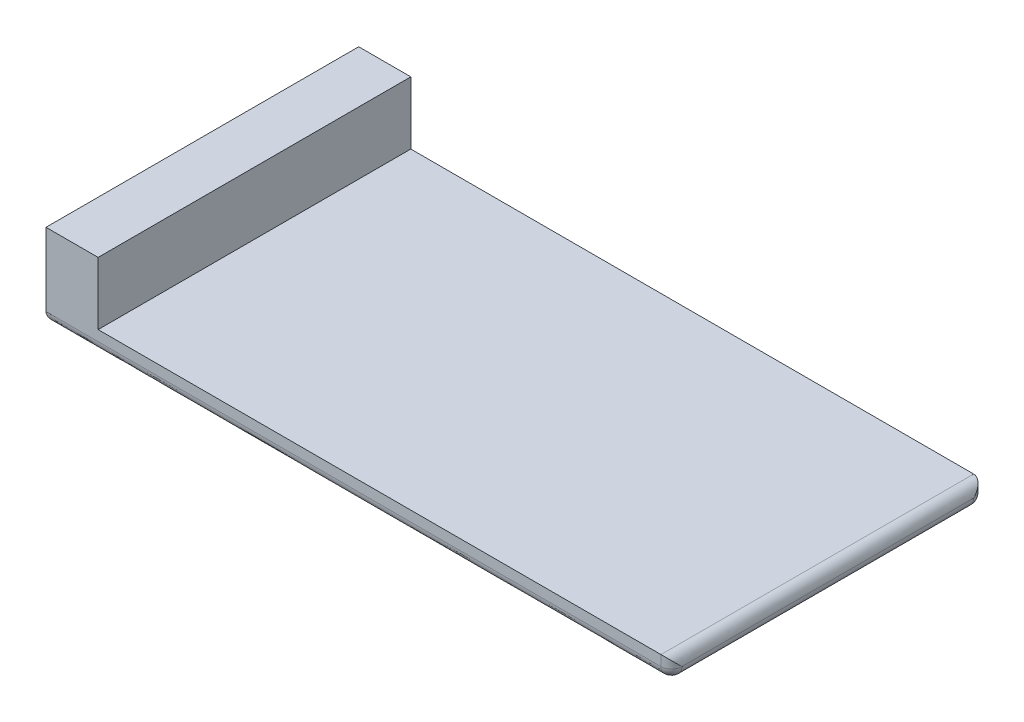
ISO-10303-21;
HEADER;
FILE_DESCRIPTION(('STEP AP214'),'2;1');
FILE_NAME('part.step','',(''),(''),'','','');
FILE_SCHEMA(('AUTOMOTIVE_DESIGN { 1 0 10303 214 1 1 1 1 }'));
ENDSEC;
DATA;
#1=APPLICATION_CONTEXT('core data for automotive mechanical design processes');
#2=APPLICATION_PROTOCOL_DEFINITION('international standard','automotive_design',2000,#1);
#3=PRODUCT_CONTEXT('',#1,'mechanical');
#4=PRODUCT('Part','Part','',(#3));
#5=PRODUCT_RELATED_PRODUCT_CATEGORY('part','',(#4));
#6=PRODUCT_DEFINITION_FORMATION('','',#4);
#7=PRODUCT_DEFINITION_CONTEXT('part definition',#1,'design');
#8=PRODUCT_DEFINITION('design','',#6,#7);
#9=PRODUCT_DEFINITION_SHAPE('','',#8);
#10=(LENGTH_UNIT() NAMED_UNIT(*) SI_UNIT(.MILLI.,.METRE.));
#11=(NAMED_UNIT(*) PLANE_ANGLE_UNIT() SI_UNIT($,.RADIAN.));
#12=(NAMED_UNIT(*) SI_UNIT($,.STERADIAN.) SOLID_ANGLE_UNIT());
#13=UNCERTAINTY_MEASURE_WITH_UNIT(LENGTH_MEASURE(1.E-05),#10,'distance_accuracy_value','');
#14=(GEOMETRIC_REPRESENTATION_CONTEXT(3) GLOBAL_UNCERTAINTY_ASSIGNED_CONTEXT((#13)) GLOBAL_UNIT_ASSIGNED_CONTEXT((#10,
#11,#12)) REPRESENTATION_CONTEXT('',''));
#15=CARTESIAN_POINT('',(0.,0.,0.));
#16=DIRECTION('',(0.,0.,1.));
#17=DIRECTION('',(1.,0.,0.));
#18=AXIS2_PLACEMENT_3D('',#15,#16,#17);
#19=CARTESIAN_POINT('',(-30.8108108108108,2.,-16.2972972972973));
#20=DIRECTION('',(1.,0.,0.));
#21=DIRECTION('',(0.,0.,-1.));
#22=AXIS2_PLACEMENT_3D('',#19,#20,#21);
#23=PLANE('',#22);
#24=DIRECTION('',(0.,-1.,0.));
#25=VECTOR('',#24,1.);
#26=CARTESIAN_POINT('',(-30.8108108108108,2.,-16.2972972972973));
#27=LINE('',#26,#25);
#28=CARTESIAN_POINT('',(-30.8108108108108,8.,-16.2972972972973));
#29=VERTEX_POINT('',#28);
#30=CARTESIAN_POINT('',(-30.8108108108108,1.,-16.2972972972973));
#31=VERTEX_POINT('',#30);
#32=EDGE_CURVE('E121',#29,#31,#27,.T.);
#33=ORIENTED_EDGE('',*,*,#32,.T.);
#34=CARTESIAN_POINT('',(-30.8108108108108,1.,-76.2972972972973));
#35=CARTESIAN_POINT('',(-30.8108108108108,1.,-56.2972972972973));
#36=CARTESIAN_POINT('',(-30.8108108108108,1.,-36.2972972972973));
#37=CARTESIAN_POINT('',(-30.8108108108108,1.,-16.2972972972973));
#38=CARTESIAN_POINT('',(-30.8108108108108,1.,-6.2972972972973));
#39=CARTESIAN_POINT('',(-30.8108108108108,1.,3.7027027027027));
#40=CARTESIAN_POINT('',(-30.8108108108108,1.,13.7027027027027));
#41=CARTESIAN_POINT('',(-30.8108108108108,1.,33.7027027027027));
#42=CARTESIAN_POINT('',(-30.8108108108108,1.,53.7027027027027));
#43=CARTESIAN_POINT('',(-30.8108108108108,1.,73.7027027027027));
#44=(BOUNDED_CURVE() B_SPLINE_CURVE(3,(#34,#35,#36,#37,#38,#39,#40,#41,#42,#43),.UNSPECIFIED.,
.F.,.F.) B_SPLINE_CURVE_WITH_KNOTS((4,3,3,4),(-0.06,0.,0.03,0.09),
.UNSPECIFIED.) CURVE() GEOMETRIC_REPRESENTATION_ITEM() RATIONAL_B_SPLINE_CURVE((1.,1.,1.,1.,1.,
1.,1.,1.,1.,1.)) REPRESENTATION_ITEM(''));
#45=CARTESIAN_POINT('',(-30.8108108108108,1.,13.7027027027027));
#46=VERTEX_POINT('',#45);
#47=EDGE_CURVE('E116',#31,#46,#44,.T.);
#48=ORIENTED_EDGE('',*,*,#47,.T.);
#49=DIRECTION('',(0.,-1.,0.));
#50=VECTOR('',#49,1.);
#51=CARTESIAN_POINT('',(-30.8108108108108,2.,13.7027027027027));
#52=LINE('',#51,#50);
#53=CARTESIAN_POINT('',(-30.8108108108108,8.,13.7027027027027));
#54=VERTEX_POINT('',#53);
#55=EDGE_CURVE('E110',#54,#46,#52,.T.);
#56=ORIENTED_EDGE('',*,*,#55,.F.);
#57=DIRECTION('',(0.,0.,1.));
#58=VECTOR('',#57,1.);
#59=CARTESIAN_POINT('',(-30.8108108108108,8.,-16.2972972972973));
#60=LINE('',#59,#58);
#61=EDGE_CURVE('E114',#29,#54,#60,.T.);
#62=ORIENTED_EDGE('',*,*,#61,.F.);
#63=EDGE_LOOP('',(#33,#48,#56,#62));
#64=FACE_BOUND('',#63,.T.);
#65=ADVANCED_FACE('F35',(#64),#23,.F.);
#66=CARTESIAN_POINT('',(-30.8108108108108,2.,13.7027027027027));
#67=DIRECTION('',(0.,0.,-1.));
#68=DIRECTION('',(-1.,0.,0.));
#69=AXIS2_PLACEMENT_3D('',#66,#67,#68);
#70=PLANE('',#69);
#71=CARTESIAN_POINT('',(-150.810810810811,1.,13.7027027027027));
#72=CARTESIAN_POINT('',(-110.810810810811,1.,13.7027027027027));
#73=CARTESIAN_POINT('',(-70.8108108108108,1.,13.7027027027027));
#74=CARTESIAN_POINT('',(-30.8108108108108,1.,13.7027027027027));
#75=CARTESIAN_POINT('',(-10.8108108108108,1.,13.7027027027027));
#76=CARTESIAN_POINT('',(9.18918918918918,1.,13.7027027027027));
#77=CARTESIAN_POINT('',(29.1891891891892,1.,13.7027027027027));
#78=CARTESIAN_POINT('',(69.1891891891892,1.,13.7027027027027));
#79=CARTESIAN_POINT('',(109.189189189189,1.,13.7027027027027));
#80=CARTESIAN_POINT('',(149.189189189189,1.,13.7027027027027));
#81=(BOUNDED_CURVE() B_SPLINE_CURVE(3,(#71,#72,#73,#74,#75,#76,#77,#78,#79,#80),.UNSPECIFIED.,
.F.,.F.) B_SPLINE_CURVE_WITH_KNOTS((4,3,3,4),(-0.12,0.,0.06,0.18),
.UNSPECIFIED.) CURVE() GEOMETRIC_REPRESENTATION_ITEM() RATIONAL_B_SPLINE_CURVE((1.,1.,1.,1.,1.,
1.,1.,1.,1.,1.)) REPRESENTATION_ITEM(''));
#82=CARTESIAN_POINT('',(28.1891891891892,1.,13.7027027027027));
#83=VERTEX_POINT('',#82);
#84=EDGE_CURVE('E188',#46,#83,#81,.T.);
#85=ORIENTED_EDGE('',*,*,#84,.T.);
#86=CARTESIAN_POINT('',(28.1891891891892,4.,13.7027027027027));
#87=CARTESIAN_POINT('',(28.1891891891892,3.33333333333333,13.7027027027027));
#88=CARTESIAN_POINT('',(28.1891891891892,2.66666666666667,13.7027027027027));
#89=CARTESIAN_POINT('',(28.1891891891892,2.,13.7027027027027));
#90=CARTESIAN_POINT('',(28.1891891891892,1.66666666666667,13.7027027027027));
#91=CARTESIAN_POINT('',(28.1891891891892,1.33333333333333,13.7027027027027));
#92=CARTESIAN_POINT('',(28.1891891891892,1.,13.7027027027027));
#93=(BOUNDED_CURVE() B_SPLINE_CURVE(3,(#86,#87,#88,#89,#90,#91,#92),.UNSPECIFIED.,.F.,
.F.) B_SPLINE_CURVE_WITH_KNOTS((4,3,4),(-0.002,0.,0.001),
.UNSPECIFIED.) CURVE() GEOMETRIC_REPRESENTATION_ITEM() RATIONAL_B_SPLINE_CURVE((1.,1.,1.,1.,1.,
1.,1.)) REPRESENTATION_ITEM(''));
#94=CARTESIAN_POINT('',(28.1891891891892,2.,13.7027027027027));
#95=VERTEX_POINT('',#94);
#96=EDGE_CURVE('E322',#83,#95,#93,.F.);
#97=ORIENTED_EDGE('',*,*,#96,.T.);
#98=DIRECTION('',(1.,0.,0.));
#99=VECTOR('',#98,1.);
#100=CARTESIAN_POINT('',(-30.8108108108108,2.,13.7027027027027));
#101=LINE('',#100,#99);
#102=CARTESIAN_POINT('',(-25.8108108108108,2.,13.7027027027027));
#103=VERTEX_POINT('',#102);
#104=EDGE_CURVE('E149',#103,#95,#101,.T.);
#105=ORIENTED_EDGE('',*,*,#104,.F.);
#106=DIRECTION('',(0.,-1.,0.));
#107=VECTOR('',#106,1.);
#108=CARTESIAN_POINT('',(-25.8108108108108,8.,13.7027027027027));
#109=LINE('',#108,#107);
#110=CARTESIAN_POINT('',(-25.8108108108108,8.,13.7027027027027));
#111=VERTEX_POINT('',#110);
#112=EDGE_CURVE('E128',#111,#103,#109,.T.);
#113=ORIENTED_EDGE('',*,*,#112,.F.);
#114=DIRECTION('',(1.,0.,0.));
#115=VECTOR('',#114,1.);
#116=CARTESIAN_POINT('',(-30.8108108108108,8.,13.7027027027027));
#117=LINE('',#116,#115);
#118=EDGE_CURVE('E124',#54,#111,#117,.T.);
#119=ORIENTED_EDGE('',*,*,#118,.F.);
#120=ORIENTED_EDGE('',*,*,#55,.T.);
#121=EDGE_LOOP('',(#85,#97,#105,#113,#119,#120));
#122=FACE_BOUND('',#121,.T.);
#123=ADVANCED_FACE('F125',(#122),#70,.F.);
#124=CARTESIAN_POINT('',(-30.8108108108108,2.,-16.2972972972973));
#125=DIRECTION('',(0.,0.,1.));
#126=DIRECTION('',(1.,0.,0.));
#127=AXIS2_PLACEMENT_3D('',#124,#125,#126);
#128=PLANE('',#127);
#129=DIRECTION('',(-1.,0.,0.));
#130=VECTOR('',#129,1.);
#131=CARTESIAN_POINT('',(-30.8108108108108,2.,-16.2972972972973));
#132=LINE('',#131,#130);
#133=CARTESIAN_POINT('',(28.1891891891892,2.,-16.2972972972973));
#134=VERTEX_POINT('',#133);
#135=CARTESIAN_POINT('',(-25.8108108108108,2.,-16.2972972972973));
#136=VERTEX_POINT('',#135);
#137=EDGE_CURVE('E151',#134,#136,#132,.T.);
#138=ORIENTED_EDGE('',*,*,#137,.F.);
#139=CARTESIAN_POINT('',(28.1891891891892,4.00000000000001,-16.2972972972973));
#140=CARTESIAN_POINT('',(28.1891891891892,3.33333333333334,-16.2972972972973));
#141=CARTESIAN_POINT('',(28.1891891891892,2.66666666666667,-16.2972972972973));
#142=CARTESIAN_POINT('',(28.1891891891892,2.,-16.2972972972973));
#143=CARTESIAN_POINT('',(28.1891891891892,1.66666666666667,-16.2972972972973));
#144=CARTESIAN_POINT('',(28.1891891891892,1.33333333333334,-16.2972972972973));
#145=CARTESIAN_POINT('',(28.1891891891892,1.00000000000001,-16.2972972972973));
#146=(BOUNDED_CURVE() B_SPLINE_CURVE(3,(#139,#140,#141,#142,#143,#144,#145),.UNSPECIFIED.,.F.,
.F.) B_SPLINE_CURVE_WITH_KNOTS((4,3,4),(-0.002,0.,0.001),
.UNSPECIFIED.) CURVE() GEOMETRIC_REPRESENTATION_ITEM() RATIONAL_B_SPLINE_CURVE((1.,1.,1.,1.,1.,
1.,1.)) REPRESENTATION_ITEM(''));
#147=CARTESIAN_POINT('',(28.1891891891892,1.,-16.2972972972973));
#148=VERTEX_POINT('',#147);
#149=EDGE_CURVE('E48',#134,#148,#146,.T.);
#150=ORIENTED_EDGE('',*,*,#149,.T.);
#151=CARTESIAN_POINT('',(149.189189189189,1.,-16.2972972972973));
#152=CARTESIAN_POINT('',(109.189189189189,1.,-16.2972972972973));
#153=CARTESIAN_POINT('',(69.1891891891892,1.,-16.2972972972973));
#154=CARTESIAN_POINT('',(29.1891891891892,1.,-16.2972972972973));
#155=CARTESIAN_POINT('',(9.18918918918919,1.,-16.2972972972973));
#156=CARTESIAN_POINT('',(-10.8108108108108,1.,-16.2972972972973));
#157=CARTESIAN_POINT('',(-30.8108108108108,1.,-16.2972972972973));
#158=CARTESIAN_POINT('',(-70.8108108108108,1.,-16.2972972972973));
#159=CARTESIAN_POINT('',(-110.810810810811,1.,-16.2972972972973));
#160=CARTESIAN_POINT('',(-150.810810810811,1.,-16.2972972972973));
#161=(BOUNDED_CURVE() B_SPLINE_CURVE(3,(#151,#152,#153,#154,#155,#156,#157,#158,#159,#160),
.UNSPECIFIED.,.F.,.F.) B_SPLINE_CURVE_WITH_KNOTS((4,3,3,4),(-0.18,-0.06,0.,0.12),
.UNSPECIFIED.) CURVE() GEOMETRIC_REPRESENTATION_ITEM() RATIONAL_B_SPLINE_CURVE((1.,1.,1.,1.,1.,
1.,1.,1.,1.,1.)) REPRESENTATION_ITEM(''));
#162=EDGE_CURVE('E195',#148,#31,#161,.T.);
#163=ORIENTED_EDGE('',*,*,#162,.T.);
#164=ORIENTED_EDGE('',*,*,#32,.F.);
#165=DIRECTION('',(-1.,0.,0.));
#166=VECTOR('',#165,1.);
#167=CARTESIAN_POINT('',(-30.8108108108108,8.,-16.2972972972973));
#168=LINE('',#167,#166);
#169=CARTESIAN_POINT('',(-25.8108108108108,8.,-16.2972972972973));
#170=VERTEX_POINT('',#169);
#171=EDGE_CURVE('E136',#170,#29,#168,.T.);
#172=ORIENTED_EDGE('',*,*,#171,.F.);
#173=DIRECTION('',(0.,-1.,0.));
#174=VECTOR('',#173,1.);
#175=CARTESIAN_POINT('',(-25.8108108108108,8.,-16.2972972972973));
#176=LINE('',#175,#174);
#177=EDGE_CURVE('E144',#170,#136,#176,.T.);
#178=ORIENTED_EDGE('',*,*,#177,.T.);
#179=EDGE_LOOP('',(#138,#150,#163,#164,#172,#178));
#180=FACE_BOUND('',#179,.T.);
#181=ADVANCED_FACE('F281',(#180),#128,.F.);
#182=CARTESIAN_POINT('',(0.,2.,0.));
#183=DIRECTION('',(0.,1.,0.));
#184=DIRECTION('',(0.,0.,1.));
#185=AXIS2_PLACEMENT_3D('',#182,#183,#184);
#186=PLANE('',#185);
#187=ORIENTED_EDGE('',*,*,#104,.T.);
#188=CARTESIAN_POINT('',(28.1891891891892,2.,73.7027027027027));
#189=CARTESIAN_POINT('',(28.1891891891892,2.,53.7027027027027));
#190=CARTESIAN_POINT('',(28.1891891891892,2.,33.7027027027027));
#191=CARTESIAN_POINT('',(28.1891891891892,2.,13.7027027027027));
#192=CARTESIAN_POINT('',(28.1891891891892,2.,3.7027027027027));
#193=CARTESIAN_POINT('',(28.1891891891892,2.,-6.2972972972973));
#194=CARTESIAN_POINT('',(28.1891891891892,2.,-16.2972972972973));
#195=CARTESIAN_POINT('',(28.1891891891892,2.,-36.2972972972973));
#196=CARTESIAN_POINT('',(28.1891891891892,2.,-56.2972972972973));
#197=CARTESIAN_POINT('',(28.1891891891892,2.,-76.2972972972973));
#198=(BOUNDED_CURVE() B_SPLINE_CURVE(3,(#188,#189,#190,#191,#192,#193,#194,#195,#196,#197),
.UNSPECIFIED.,.F.,.F.) B_SPLINE_CURVE_WITH_KNOTS((4,3,3,4),(-0.09,-0.03,0.,0.06),
.UNSPECIFIED.) CURVE() GEOMETRIC_REPRESENTATION_ITEM() RATIONAL_B_SPLINE_CURVE((1.,1.,1.,1.,1.,
1.,1.,1.,1.,1.)) REPRESENTATION_ITEM(''));
#199=EDGE_CURVE('E11',#95,#134,#198,.T.);
#200=ORIENTED_EDGE('',*,*,#199,.T.);
#201=ORIENTED_EDGE('',*,*,#137,.T.);
#202=DIRECTION('',(0.,0.,-1.));
#203=VECTOR('',#202,1.);
#204=CARTESIAN_POINT('',(-25.8108108108108,2.,-16.2972972972973));
#205=LINE('',#204,#203);
#206=EDGE_CURVE('E137',#103,#136,#205,.T.);
#207=ORIENTED_EDGE('',*,*,#206,.F.);
#208=EDGE_LOOP('',(#187,#200,#201,#207));
#209=FACE_BOUND('',#208,.T.);
#210=ADVANCED_FACE('F284',(#209),#186,.T.);
#211=CARTESIAN_POINT('',(0.,0.,0.));
#212=DIRECTION('',(0.,1.,0.));
#213=DIRECTION('',(0.,0.,1.));
#214=AXIS2_PLACEMENT_3D('',#211,#212,#213);
#215=PLANE('',#214);
#216=CARTESIAN_POINT('',(149.189189189189,0.,-15.2972972972973));
#217=CARTESIAN_POINT('',(109.189189189189,0.,-15.2972972972973));
#218=CARTESIAN_POINT('',(69.1891891891892,0.,-15.2972972972973));
#219=CARTESIAN_POINT('',(29.1891891891892,0.,-15.2972972972973));
#220=CARTESIAN_POINT('',(9.18918918918919,0.,-15.2972972972973));
#221=CARTESIAN_POINT('',(-10.8108108108108,0.,-15.2972972972973));
#222=CARTESIAN_POINT('',(-30.8108108108108,0.,-15.2972972972973));
#223=CARTESIAN_POINT('',(-70.8108108108108,0.,-15.2972972972973));
#224=CARTESIAN_POINT('',(-110.810810810811,0.,-15.2972972972973));
#225=CARTESIAN_POINT('',(-150.810810810811,0.,-15.2972972972973));
#226=(BOUNDED_CURVE() B_SPLINE_CURVE(3,(#216,#217,#218,#219,#220,#221,#222,#223,#224,#225),
.UNSPECIFIED.,.F.,.F.) B_SPLINE_CURVE_WITH_KNOTS((4,3,3,4),(-0.18,-0.06,0.,0.12),
.UNSPECIFIED.) CURVE() GEOMETRIC_REPRESENTATION_ITEM() RATIONAL_B_SPLINE_CURVE((1.,1.,1.,1.,1.,
1.,1.,1.,1.,1.)) REPRESENTATION_ITEM(''));
#227=CARTESIAN_POINT('',(-29.8108108108108,0.,-15.2972972972973));
#228=VERTEX_POINT('',#227);
#229=CARTESIAN_POINT('',(28.1891891891892,0.,-15.2972972972973));
#230=VERTEX_POINT('',#229);
#231=EDGE_CURVE('E165',#228,#230,#226,.F.);
#232=ORIENTED_EDGE('',*,*,#231,.T.);
#233=CARTESIAN_POINT('',(28.1891891891892,0.,73.7027027027027));
#234=CARTESIAN_POINT('',(28.1891891891892,0.,53.7027027027027));
#235=CARTESIAN_POINT('',(28.1891891891892,0.,33.7027027027027));
#236=CARTESIAN_POINT('',(28.1891891891892,0.,13.7027027027027));
#237=CARTESIAN_POINT('',(28.1891891891892,0.,3.7027027027027));
#238=CARTESIAN_POINT('',(28.1891891891892,0.,-6.2972972972973));
#239=CARTESIAN_POINT('',(28.1891891891892,0.,-16.2972972972973));
#240=CARTESIAN_POINT('',(28.1891891891892,0.,-36.2972972972973));
#241=CARTESIAN_POINT('',(28.1891891891892,0.,-56.2972972972973));
#242=CARTESIAN_POINT('',(28.1891891891892,0.,-76.2972972972973));
#243=(BOUNDED_CURVE() B_SPLINE_CURVE(3,(#233,#234,#235,#236,#237,#238,#239,#240,#241,#242),
.UNSPECIFIED.,.F.,.F.) B_SPLINE_CURVE_WITH_KNOTS((4,3,3,4),(-0.09,-0.03,0.,0.06),
.UNSPECIFIED.) CURVE() GEOMETRIC_REPRESENTATION_ITEM() RATIONAL_B_SPLINE_CURVE((1.,1.,1.,1.,1.,
1.,1.,1.,1.,1.)) REPRESENTATION_ITEM(''));
#244=CARTESIAN_POINT('',(28.1891891891892,0.,12.7027027027027));
#245=VERTEX_POINT('',#244);
#246=EDGE_CURVE('E180',#230,#245,#243,.F.);
#247=ORIENTED_EDGE('',*,*,#246,.T.);
#248=CARTESIAN_POINT('',(-150.810810810811,0.,12.7027027027027));
#249=CARTESIAN_POINT('',(-110.810810810811,0.,12.7027027027027));
#250=CARTESIAN_POINT('',(-70.8108108108108,0.,12.7027027027027));
#251=CARTESIAN_POINT('',(-30.8108108108108,0.,12.7027027027027));
#252=CARTESIAN_POINT('',(-10.8108108108108,0.,12.7027027027027));
#253=CARTESIAN_POINT('',(9.18918918918918,0.,12.7027027027027));
#254=CARTESIAN_POINT('',(29.1891891891892,0.,12.7027027027027));
#255=CARTESIAN_POINT('',(69.1891891891892,0.,12.7027027027027));
#256=CARTESIAN_POINT('',(109.189189189189,0.,12.7027027027027));
#257=CARTESIAN_POINT('',(149.189189189189,0.,12.7027027027027));
#258=(BOUNDED_CURVE() B_SPLINE_CURVE(3,(#248,#249,#250,#251,#252,#253,#254,#255,#256,#257),
.UNSPECIFIED.,.F.,.F.) B_SPLINE_CURVE_WITH_KNOTS((4,3,3,4),(-0.12,0.,0.06,0.18),
.UNSPECIFIED.) CURVE() GEOMETRIC_REPRESENTATION_ITEM() RATIONAL_B_SPLINE_CURVE((1.,1.,1.,1.,1.,
1.,1.,1.,1.,1.)) REPRESENTATION_ITEM(''));
#259=CARTESIAN_POINT('',(-29.8108108108108,0.,12.7027027027027));
#260=VERTEX_POINT('',#259);
#261=EDGE_CURVE('E173',#245,#260,#258,.F.);
#262=ORIENTED_EDGE('',*,*,#261,.T.);
#263=CARTESIAN_POINT('',(-29.8108108108108,0.,-76.2972972972973));
#264=CARTESIAN_POINT('',(-29.8108108108108,0.,-56.2972972972973));
#265=CARTESIAN_POINT('',(-29.8108108108108,0.,-36.2972972972973));
#266=CARTESIAN_POINT('',(-29.8108108108108,0.,-16.2972972972973));
#267=CARTESIAN_POINT('',(-29.8108108108108,0.,-6.2972972972973));
#268=CARTESIAN_POINT('',(-29.8108108108108,0.,3.7027027027027));
#269=CARTESIAN_POINT('',(-29.8108108108108,0.,13.7027027027027));
#270=CARTESIAN_POINT('',(-29.8108108108108,0.,33.7027027027027));
#271=CARTESIAN_POINT('',(-29.8108108108108,0.,53.7027027027027));
#272=CARTESIAN_POINT('',(-29.8108108108108,0.,73.7027027027027));
#273=(BOUNDED_CURVE() B_SPLINE_CURVE(3,(#263,#264,#265,#266,#267,#268,#269,#270,#271,#272),
.UNSPECIFIED.,.F.,.F.) B_SPLINE_CURVE_WITH_KNOTS((4,3,3,4),(-0.06,0.,0.03,0.09),
.UNSPECIFIED.) CURVE() GEOMETRIC_REPRESENTATION_ITEM() RATIONAL_B_SPLINE_CURVE((1.,1.,1.,1.,1.,
1.,1.,1.,1.,1.)) REPRESENTATION_ITEM(''));
#274=EDGE_CURVE('E158',#260,#228,#273,.F.);
#275=ORIENTED_EDGE('',*,*,#274,.T.);
#276=EDGE_LOOP('',(#232,#247,#262,#275));
#277=FACE_BOUND('',#276,.T.);
#278=ADVANCED_FACE('F285',(#277),#215,.F.);
#279=CARTESIAN_POINT('',(-25.8108108108108,8.,-16.2972972972973));
#280=DIRECTION('',(-1.,0.,0.));
#281=DIRECTION('',(0.,0.,1.));
#282=AXIS2_PLACEMENT_3D('',#279,#280,#281);
#283=PLANE('',#282);
#284=ORIENTED_EDGE('',*,*,#206,.T.);
#285=ORIENTED_EDGE('',*,*,#177,.F.);
#286=DIRECTION('',(0.,0.,-1.));
#287=VECTOR('',#286,1.);
#288=CARTESIAN_POINT('',(-25.8108108108108,8.,-16.2972972972973));
#289=LINE('',#288,#287);
#290=EDGE_CURVE('E131',#111,#170,#289,.T.);
#291=ORIENTED_EDGE('',*,*,#290,.F.);
#292=ORIENTED_EDGE('',*,*,#112,.T.);
#293=EDGE_LOOP('',(#284,#285,#291,#292));
#294=FACE_BOUND('',#293,.T.);
#295=ADVANCED_FACE('F288',(#294),#283,.F.);
#296=CARTESIAN_POINT('',(0.,8.,0.));
#297=DIRECTION('',(0.,1.,0.));
#298=DIRECTION('',(0.,0.,1.));
#299=AXIS2_PLACEMENT_3D('',#296,#297,#298);
#300=PLANE('',#299);
#301=ORIENTED_EDGE('',*,*,#61,.T.);
#302=ORIENTED_EDGE('',*,*,#118,.T.);
#303=ORIENTED_EDGE('',*,*,#290,.T.);
#304=ORIENTED_EDGE('',*,*,#171,.T.);
#305=EDGE_LOOP('',(#301,#302,#303,#304));
#306=FACE_BOUND('',#305,.T.);
#307=ADVANCED_FACE('F134',(#306),#300,.T.);
#308=CARTESIAN_POINT('',(-30.8108108108108,1.,-22.5492972972973));
#309=CARTESIAN_POINT('',(-30.8108108108108,1.,-20.4652972972973));
#310=CARTESIAN_POINT('',(-30.8108108108108,1.,-18.3812972972973));
#311=CARTESIAN_POINT('',(-30.8108108108108,1.,-16.2972972972973));
#312=CARTESIAN_POINT('',(-30.8108108108108,1.,-6.2972972972973));
#313=CARTESIAN_POINT('',(-30.8108108108108,1.,3.7027027027027));
#314=CARTESIAN_POINT('',(-30.8108108108108,1.,13.7027027027027));
#315=CARTESIAN_POINT('',(-30.8108108108108,1.,15.7867027027027));
#316=CARTESIAN_POINT('',(-30.8108108108108,1.,17.8707027027027));
#317=CARTESIAN_POINT('',(-30.8108108108108,1.,19.9547027027027));
#318=CARTESIAN_POINT('',(-30.8108108108108,0.,-22.5492972972973));
#319=CARTESIAN_POINT('',(-30.8108108108108,0.,-20.4652972972973));
#320=CARTESIAN_POINT('',(-30.8108108108108,0.,-18.3812972972973));
#321=CARTESIAN_POINT('',(-30.8108108108108,0.,-16.2972972972973));
#322=CARTESIAN_POINT('',(-30.8108108108108,0.,-6.2972972972973));
#323=CARTESIAN_POINT('',(-30.8108108108108,0.,3.7027027027027));
#324=CARTESIAN_POINT('',(-30.8108108108108,0.,13.7027027027027));
#325=CARTESIAN_POINT('',(-30.8108108108108,0.,15.7867027027027));
#326=CARTESIAN_POINT('',(-30.8108108108108,0.,17.8707027027027));
#327=CARTESIAN_POINT('',(-30.8108108108108,0.,19.9547027027027));
#328=CARTESIAN_POINT('',(-29.8108108108108,0.,-22.5492972972973));
#329=CARTESIAN_POINT('',(-29.8108108108108,0.,-20.4652972972973));
#330=CARTESIAN_POINT('',(-29.8108108108108,0.,-18.3812972972973));
#331=CARTESIAN_POINT('',(-29.8108108108108,0.,-16.2972972972973));
#332=CARTESIAN_POINT('',(-29.8108108108108,0.,-6.2972972972973));
#333=CARTESIAN_POINT('',(-29.8108108108108,0.,3.7027027027027));
#334=CARTESIAN_POINT('',(-29.8108108108108,0.,13.7027027027027));
#335=CARTESIAN_POINT('',(-29.8108108108108,0.,15.7867027027027));
#336=CARTESIAN_POINT('',(-29.8108108108108,0.,17.8707027027027));
#337=CARTESIAN_POINT('',(-29.8108108108108,0.,19.9547027027027));
#338=(BOUNDED_SURFACE() B_SPLINE_SURFACE(2,3,((#308,#309,#310,#311,#312,#313,#314,#315,#316,
#317),(#318,#319,#320,#321,#322,#323,#324,#325,#326,#327),(#328,#329,#330,#331,#332,#333,#334,
#335,#336,#337)),.UNSPECIFIED.,.F.,.F.,.F.) B_SPLINE_SURFACE_WITH_KNOTS((3,3),(4,3,3,4),(0.,1.),
(-0.006252,0.,0.03,0.036252),
.UNSPECIFIED.) GEOMETRIC_REPRESENTATION_ITEM() RATIONAL_B_SPLINE_SURFACE(((1.,1.,1.,1.,1.,1.,1.,
1.,1.,1.),(0.707106781186548,0.707106781186548,0.707106781186548,0.707106781186548,
0.707106781186548,0.707106781186548,0.707106781186548,0.707106781186548,0.707106781186548,
0.707106781186548),(1.,1.,1.,1.,1.,1.,1.,1.,1.,1.))) REPRESENTATION_ITEM('') SURFACE());
#339=CARTESIAN_POINT('',(-30.8108108108108,1.,-16.2972972972973));
#340=CARTESIAN_POINT('',(-30.8108138388673,0.977567472566778,-16.2973003253538));
#341=CARTESIAN_POINT('',(-30.8100553199105,0.955148806119165,-16.296541806397));
#342=CARTESIAN_POINT('',(-30.8070505886579,0.910528961228603,-16.2935370751444));
#343=CARTESIAN_POINT('',(-30.8048055407529,0.888327626352126,-16.2912920272394));
#344=CARTESIAN_POINT('',(-30.7959477542092,0.822695613271542,-16.2824342406957));
#345=CARTESIAN_POINT('',(-30.7872108638477,0.779808426642863,-16.2736973503342));
#346=CARTESIAN_POINT('',(-30.7647493548053,0.696939360315883,-16.2512358412918));
#347=CARTESIAN_POINT('',(-30.7510384551773,0.656949848905717,-16.2375249416638));
#348=CARTESIAN_POINT('',(-30.7194428237196,0.580345759346921,-16.2059293102061));
#349=CARTESIAN_POINT('',(-30.7015486642523,0.543739068851591,-16.1880351507388));
#350=CARTESIAN_POINT('',(-30.6544329288289,0.460138431002216,-16.1409194153154));
#351=CARTESIAN_POINT('',(-30.6235682674892,0.414998793200906,-16.1100547539757));
#352=CARTESIAN_POINT('',(-30.5571353033284,0.332298722531118,-16.0436217898149));
#353=CARTESIAN_POINT('',(-30.521558119997,0.294752946089676,-16.0080446064835));
#354=CARTESIAN_POINT('',(-30.4327389778559,0.213819938450044,-15.9192254643424));
#355=CARTESIAN_POINT('',(-30.3779794686667,0.173772536557638,-15.8644659551532));
#356=CARTESIAN_POINT('',(-30.2646905215754,0.10650066976041,-15.7511770080619));
#357=CARTESIAN_POINT('',(-30.206156665357,0.0792915551011758,-15.6926431518435));
#358=CARTESIAN_POINT('',(-30.0924384520769,0.0387571830153406,-15.5789249385634));
#359=CARTESIAN_POINT('',(-30.0374345969965,0.0243930953812694,-15.523921083483));
#360=CARTESIAN_POINT('',(-29.9266986811635,0.00515371082379888,-15.41318516765));
#361=CARTESIAN_POINT('',(-29.8709683593819,0.000258874111870943,-15.3574548458683));
#362=CARTESIAN_POINT('',(-29.8137921996245,3.33747395311492E-06,-15.300278686111));
#363=CARTESIAN_POINT('',(-29.8123014846687,4.56489469770676E-09,-15.2987879711552));
#364=CARTESIAN_POINT('',(-29.8108108108107,0.,-15.2972972972972));
#365=B_SPLINE_CURVE_WITH_KNOTS('',3,(#339,#340,#341,#342,#343,#344,#345,#346,#347,#348,#349,
#350,#351,#352,#353,#354,#355,#356,#357,#358,#359,#360,#361,#362,#363,#364),.UNSPECIFIED.,.F.,
.F.,(4,2,2,2,2,2,2,2,2,2,2,2,4),(0.,0.0672457396048317,0.134438868172214,0.267559824129506,
0.400316370108638,0.533375038354726,0.720712178250308,0.908407505989956,1.16855696340393,
1.42901668818514,1.66575363888481,1.90200155988639,1.90832612311249),.UNSPECIFIED.);
#366=EDGE_CURVE('E209',#228,#31,#365,.F.);
#367=CARTESIAN_POINT('',(-30.8108108108108,1.,13.7027027027027));
#368=CARTESIAN_POINT('',(-30.8108138388673,0.977567472566778,13.7027057307592));
#369=CARTESIAN_POINT('',(-30.8100553199105,0.955148806119164,13.7019472118024));
#370=CARTESIAN_POINT('',(-30.8070505886579,0.910528961228602,13.6989424805498));
#371=CARTESIAN_POINT('',(-30.8048055407529,0.888327626352125,13.6966974326448));
#372=CARTESIAN_POINT('',(-30.7959477542092,0.822695613271541,13.6878396461011));
#373=CARTESIAN_POINT('',(-30.7872108638477,0.779808426642862,13.6791027557396));
#374=CARTESIAN_POINT('',(-30.7647493548053,0.696939360315882,13.6566412466972));
#375=CARTESIAN_POINT('',(-30.7510384551773,0.656949848905714,13.6429303470692));
#376=CARTESIAN_POINT('',(-30.7194428237196,0.580345759346916,13.6113347156115));
#377=CARTESIAN_POINT('',(-30.7015486642524,0.543739068851587,13.5934405561442));
#378=CARTESIAN_POINT('',(-30.6544329288289,0.460138431002213,13.5463248207208));
#379=CARTESIAN_POINT('',(-30.6235682674892,0.414998793200905,13.5154601593811));
#380=CARTESIAN_POINT('',(-30.5571353033285,0.332298722531116,13.4490271952204));
#381=CARTESIAN_POINT('',(-30.521558119997,0.294752946089673,13.4134500118889));
#382=CARTESIAN_POINT('',(-30.4327389778559,0.21381993845004,13.3246308697478));
#383=CARTESIAN_POINT('',(-30.3779794686667,0.173772536557635,13.2698713605586));
#384=CARTESIAN_POINT('',(-30.2646905215754,0.106500669760408,13.1565824134673));
#385=CARTESIAN_POINT('',(-30.206156665357,0.0792915551011717,13.0980485572489));
#386=CARTESIAN_POINT('',(-30.0924384520769,0.0387571830153374,12.9843303439688));
#387=CARTESIAN_POINT('',(-30.0374345969965,0.0243930953812678,12.9293264888885));
#388=CARTESIAN_POINT('',(-29.9266986811635,0.00515371082379898,12.8185905730554));
#389=CARTESIAN_POINT('',(-29.8709683593819,0.000258874111870865,12.7628602512737));
#390=CARTESIAN_POINT('',(-29.8137921996245,3.33747395311173E-06,12.7056840915164));
#391=CARTESIAN_POINT('',(-29.8123014846687,4.56489469662312E-09,12.7041933765606));
#392=CARTESIAN_POINT('',(-29.8108108108107,0.,12.7027027027026));
#393=B_SPLINE_CURVE_WITH_KNOTS('',3,(#367,#368,#369,#370,#371,#372,#373,#374,#375,#376,#377,
#378,#379,#380,#381,#382,#383,#384,#385,#386,#387,#388,#389,#390,#391,#392),.UNSPECIFIED.,.F.,
.F.,(4,2,2,2,2,2,2,2,2,2,2,2,4),(0.,0.0672457396048324,0.134438868172214,0.267559824129509,
0.400316370108641,0.533375038354726,0.720712178250308,0.908407505989961,1.16855696340393,
1.42901668818515,1.66575363888482,1.9020015598864,1.9083261231125),.UNSPECIFIED.);
#394=EDGE_CURVE('E140',#46,#260,#393,.T.);
#395=ORIENTED_EDGE('',*,*,#366,.F.);
#396=ORIENTED_EDGE('',*,*,#274,.F.);
#397=ORIENTED_EDGE('',*,*,#394,.F.);
#398=ORIENTED_EDGE('',*,*,#47,.F.);
#399=EDGE_LOOP('',(#395,#396,#397,#398));
#400=FACE_BOUND('',#399,.T.);
#401=ADVANCED_FACE('F228',(#400),#338,.T.);
#402=CARTESIAN_POINT('',(-43.3148108108109,1.,13.7027027027027));
#403=CARTESIAN_POINT('',(-39.1468108108108,1.,13.7027027027027));
#404=CARTESIAN_POINT('',(-34.9788108108108,1.,13.7027027027027));
#405=CARTESIAN_POINT('',(-30.8108108108108,1.,13.7027027027027));
#406=CARTESIAN_POINT('',(-10.8108108108108,1.,13.7027027027027));
#407=CARTESIAN_POINT('',(9.18918918918918,1.,13.7027027027027));
#408=CARTESIAN_POINT('',(29.1891891891892,1.,13.7027027027027));
#409=CARTESIAN_POINT('',(33.3571891891892,1.,13.7027027027027));
#410=CARTESIAN_POINT('',(37.5251891891892,1.,13.7027027027027));
#411=CARTESIAN_POINT('',(41.6931891891893,1.,13.7027027027027));
#412=CARTESIAN_POINT('',(-43.3148108108108,0.,13.7027027027027));
#413=CARTESIAN_POINT('',(-39.1468108108108,0.,13.7027027027027));
#414=CARTESIAN_POINT('',(-34.9788108108108,0.,13.7027027027027));
#415=CARTESIAN_POINT('',(-30.8108108108108,0.,13.7027027027027));
#416=CARTESIAN_POINT('',(-10.8108108108108,0.,13.7027027027027));
#417=CARTESIAN_POINT('',(9.18918918918918,0.,13.7027027027027));
#418=CARTESIAN_POINT('',(29.1891891891892,0.,13.7027027027027));
#419=CARTESIAN_POINT('',(33.3571891891892,0.,13.7027027027027));
#420=CARTESIAN_POINT('',(37.5251891891892,0.,13.7027027027027));
#421=CARTESIAN_POINT('',(41.6931891891892,0.,13.7027027027027));
#422=CARTESIAN_POINT('',(-43.3148108108109,0.,12.7027027027027));
#423=CARTESIAN_POINT('',(-39.1468108108108,0.,12.7027027027027));
#424=CARTESIAN_POINT('',(-34.9788108108108,0.,12.7027027027027));
#425=CARTESIAN_POINT('',(-30.8108108108108,0.,12.7027027027027));
#426=CARTESIAN_POINT('',(-10.8108108108108,0.,12.7027027027027));
#427=CARTESIAN_POINT('',(9.18918918918918,0.,12.7027027027027));
#428=CARTESIAN_POINT('',(29.1891891891892,0.,12.7027027027027));
#429=CARTESIAN_POINT('',(33.3571891891892,0.,12.7027027027027));
#430=CARTESIAN_POINT('',(37.5251891891892,0.,12.7027027027027));
#431=CARTESIAN_POINT('',(41.6931891891893,0.,12.7027027027027));
#432=(BOUNDED_SURFACE() B_SPLINE_SURFACE(2,3,((#402,#403,#404,#405,#406,#407,#408,#409,#410,
#411),(#412,#413,#414,#415,#416,#417,#418,#419,#420,#421),(#422,#423,#424,#425,#426,#427,#428,
#429,#430,#431)),.UNSPECIFIED.,.F.,.F.,.F.) B_SPLINE_SURFACE_WITH_KNOTS((3,3),(4,3,3,4),(0.,1.),
(-0.012504,0.,0.06,0.0725040000000001),
.UNSPECIFIED.) GEOMETRIC_REPRESENTATION_ITEM() RATIONAL_B_SPLINE_SURFACE(((1.,1.,1.,1.,1.,1.,1.,
1.,1.,1.),(0.707106781186548,0.707106781186548,0.707106781186548,0.707106781186548,
0.707106781186548,0.707106781186548,0.707106781186548,0.707106781186548,0.707106781186548,
0.707106781186548),(1.,1.,1.,1.,1.,1.,1.,1.,1.,1.))) REPRESENTATION_ITEM('') SURFACE());
#433=CARTESIAN_POINT('',(28.1891891891892,1.0000000000005,12.7027027027022));
#434=DIRECTION('',(1.,0.,0.));
#435=DIRECTION('',(0.,0.,-1.));
#436=AXIS2_PLACEMENT_3D('',#433,#434,#435);
#437=CIRCLE('',#436,1.);
#438=EDGE_CURVE('E318',#245,#83,#437,.F.);
#439=ORIENTED_EDGE('',*,*,#261,.F.);
#440=ORIENTED_EDGE('',*,*,#438,.T.);
#441=ORIENTED_EDGE('',*,*,#84,.F.);
#442=ORIENTED_EDGE('',*,*,#394,.T.);
#443=EDGE_LOOP('',(#439,#440,#441,#442));
#444=FACE_BOUND('',#443,.T.);
#445=ADVANCED_FACE('F243',(#444),#432,.T.);
#446=CARTESIAN_POINT('',(41.6931891891892,1.,-16.2972972972973));
#447=CARTESIAN_POINT('',(37.5251891891892,1.,-16.2972972972973));
#448=CARTESIAN_POINT('',(33.3571891891892,1.,-16.2972972972973));
#449=CARTESIAN_POINT('',(29.1891891891892,1.,-16.2972972972973));
#450=CARTESIAN_POINT('',(9.18918918918919,1.,-16.2972972972973));
#451=CARTESIAN_POINT('',(-10.8108108108108,1.,-16.2972972972973));
#452=CARTESIAN_POINT('',(-30.8108108108108,1.,-16.2972972972973));
#453=CARTESIAN_POINT('',(-34.9788108108108,1.,-16.2972972972973));
#454=CARTESIAN_POINT('',(-39.1468108108108,1.,-16.2972972972973));
#455=CARTESIAN_POINT('',(-43.3148108108108,1.,-16.2972972972973));
#456=CARTESIAN_POINT('',(41.6931891891892,0.,-16.2972972972973));
#457=CARTESIAN_POINT('',(37.5251891891892,0.,-16.2972972972973));
#458=CARTESIAN_POINT('',(33.3571891891892,0.,-16.2972972972973));
#459=CARTESIAN_POINT('',(29.1891891891892,0.,-16.2972972972973));
#460=CARTESIAN_POINT('',(9.18918918918919,0.,-16.2972972972973));
#461=CARTESIAN_POINT('',(-10.8108108108108,0.,-16.2972972972973));
#462=CARTESIAN_POINT('',(-30.8108108108108,0.,-16.2972972972973));
#463=CARTESIAN_POINT('',(-34.9788108108108,0.,-16.2972972972973));
#464=CARTESIAN_POINT('',(-39.1468108108108,0.,-16.2972972972973));
#465=CARTESIAN_POINT('',(-43.3148108108108,0.,-16.2972972972973));
#466=CARTESIAN_POINT('',(41.6931891891892,0.,-15.2972972972973));
#467=CARTESIAN_POINT('',(37.5251891891892,0.,-15.2972972972973));
#468=CARTESIAN_POINT('',(33.3571891891892,0.,-15.2972972972973));
#469=CARTESIAN_POINT('',(29.1891891891892,0.,-15.2972972972973));
#470=CARTESIAN_POINT('',(9.18918918918919,0.,-15.2972972972973));
#471=CARTESIAN_POINT('',(-10.8108108108108,0.,-15.2972972972973));
#472=CARTESIAN_POINT('',(-30.8108108108108,0.,-15.2972972972973));
#473=CARTESIAN_POINT('',(-34.9788108108108,0.,-15.2972972972973));
#474=CARTESIAN_POINT('',(-39.1468108108108,0.,-15.2972972972973));
#475=CARTESIAN_POINT('',(-43.3148108108108,0.,-15.2972972972973));
#476=(BOUNDED_SURFACE() B_SPLINE_SURFACE(2,3,((#446,#447,#448,#449,#450,#451,#452,#453,#454,
#455),(#456,#457,#458,#459,#460,#461,#462,#463,#464,#465),(#466,#467,#468,#469,#470,#471,#472,
#473,#474,#475)),.UNSPECIFIED.,.F.,.F.,.F.) B_SPLINE_SURFACE_WITH_KNOTS((3,3),(4,3,3,4),(0.,1.),
(-0.072504,-0.06,0.,0.012504),
.UNSPECIFIED.) GEOMETRIC_REPRESENTATION_ITEM() RATIONAL_B_SPLINE_SURFACE(((1.,1.,1.,1.,1.,1.,1.,
1.,1.,1.),(0.707106781186548,0.707106781186548,0.707106781186548,0.707106781186548,
0.707106781186548,0.707106781186548,0.707106781186548,0.707106781186548,0.707106781186548,
0.707106781186548),(1.,1.,1.,1.,1.,1.,1.,1.,1.,1.))) REPRESENTATION_ITEM('') SURFACE());
#477=CARTESIAN_POINT('',(28.1891891891892,1.0000000000001,-15.2972972972972));
#478=DIRECTION('',(-1.,0.,0.));
#479=DIRECTION('',(0.,0.,1.));
#480=AXIS2_PLACEMENT_3D('',#477,#478,#479);
#481=CIRCLE('',#480,1.);
#482=EDGE_CURVE('E307',#148,#230,#481,.T.);
#483=ORIENTED_EDGE('',*,*,#162,.F.);
#484=ORIENTED_EDGE('',*,*,#482,.T.);
#485=ORIENTED_EDGE('',*,*,#231,.F.);
#486=ORIENTED_EDGE('',*,*,#366,.T.);
#487=EDGE_LOOP('',(#483,#484,#485,#486));
#488=FACE_BOUND('',#487,.T.);
#489=ADVANCED_FACE('F234',(#488),#476,.T.);
#490=CARTESIAN_POINT('',(29.1891891891892,1.,19.9547027027027));
#491=CARTESIAN_POINT('',(29.1891891891892,1.,17.8707027027027));
#492=CARTESIAN_POINT('',(29.1891891891892,1.,15.7867027027027));
#493=CARTESIAN_POINT('',(29.1891891891892,1.,13.7027027027027));
#494=CARTESIAN_POINT('',(29.1891891891892,1.,3.7027027027027));
#495=CARTESIAN_POINT('',(29.1891891891892,1.,-6.2972972972973));
#496=CARTESIAN_POINT('',(29.1891891891892,1.,-16.2972972972973));
#497=CARTESIAN_POINT('',(29.1891891891892,1.,-18.3812972972973));
#498=CARTESIAN_POINT('',(29.1891891891892,1.,-20.4652972972973));
#499=CARTESIAN_POINT('',(29.1891891891892,1.,-22.5492972972973));
#500=CARTESIAN_POINT('',(29.1891891891892,0.,19.9547027027027));
#501=CARTESIAN_POINT('',(29.1891891891892,0.,17.8707027027027));
#502=CARTESIAN_POINT('',(29.1891891891892,0.,15.7867027027027));
#503=CARTESIAN_POINT('',(29.1891891891892,0.,13.7027027027027));
#504=CARTESIAN_POINT('',(29.1891891891892,0.,3.7027027027027));
#505=CARTESIAN_POINT('',(29.1891891891892,0.,-6.2972972972973));
#506=CARTESIAN_POINT('',(29.1891891891892,0.,-16.2972972972973));
#507=CARTESIAN_POINT('',(29.1891891891892,0.,-18.3812972972973));
#508=CARTESIAN_POINT('',(29.1891891891892,0.,-20.4652972972973));
#509=CARTESIAN_POINT('',(29.1891891891892,0.,-22.5492972972973));
#510=CARTESIAN_POINT('',(28.1891891891892,0.,19.9547027027027));
#511=CARTESIAN_POINT('',(28.1891891891892,0.,17.8707027027027));
#512=CARTESIAN_POINT('',(28.1891891891892,0.,15.7867027027027));
#513=CARTESIAN_POINT('',(28.1891891891892,0.,13.7027027027027));
#514=CARTESIAN_POINT('',(28.1891891891892,0.,3.7027027027027));
#515=CARTESIAN_POINT('',(28.1891891891892,0.,-6.2972972972973));
#516=CARTESIAN_POINT('',(28.1891891891892,0.,-16.2972972972973));
#517=CARTESIAN_POINT('',(28.1891891891892,0.,-18.3812972972973));
#518=CARTESIAN_POINT('',(28.1891891891892,0.,-20.4652972972973));
#519=CARTESIAN_POINT('',(28.1891891891892,0.,-22.5492972972973));
#520=(BOUNDED_SURFACE() B_SPLINE_SURFACE(2,3,((#490,#491,#492,#493,#494,#495,#496,#497,#498,
#499),(#500,#501,#502,#503,#504,#505,#506,#507,#508,#509),(#510,#511,#512,#513,#514,#515,#516,
#517,#518,#519)),.UNSPECIFIED.,.F.,.F.,.F.) B_SPLINE_SURFACE_WITH_KNOTS((3,3),(4,3,3,4),(0.,1.),
(-0.036252,-0.03,0.,0.006252),
.UNSPECIFIED.) GEOMETRIC_REPRESENTATION_ITEM() RATIONAL_B_SPLINE_SURFACE(((1.,1.,1.,1.,1.,1.,1.,
1.,1.,1.),(0.707106781186548,0.707106781186548,0.707106781186548,0.707106781186548,
0.707106781186548,0.707106781186548,0.707106781186548,0.707106781186548,0.707106781186548,
0.707106781186548),(1.,1.,1.,1.,1.,1.,1.,1.,1.,1.))) REPRESENTATION_ITEM('') SURFACE());
#521=CARTESIAN_POINT('',(29.1891891891892,1.,73.7027027027027));
#522=CARTESIAN_POINT('',(29.1891891891892,1.,53.7027027027027));
#523=CARTESIAN_POINT('',(29.1891891891892,1.,33.7027027027027));
#524=CARTESIAN_POINT('',(29.1891891891892,1.,13.7027027027027));
#525=CARTESIAN_POINT('',(29.1891891891892,1.,3.7027027027027));
#526=CARTESIAN_POINT('',(29.1891891891892,1.,-6.2972972972973));
#527=CARTESIAN_POINT('',(29.1891891891892,1.,-16.2972972972973));
#528=CARTESIAN_POINT('',(29.1891891891892,1.,-36.2972972972973));
#529=CARTESIAN_POINT('',(29.1891891891892,1.,-56.2972972972973));
#530=CARTESIAN_POINT('',(29.1891891891892,1.,-76.2972972972973));
#531=(BOUNDED_CURVE() B_SPLINE_CURVE(3,(#521,#522,#523,#524,#525,#526,#527,#528,#529,#530),
.UNSPECIFIED.,.F.,.F.) B_SPLINE_CURVE_WITH_KNOTS((4,3,3,4),(-0.09,-0.03,0.,0.06),
.UNSPECIFIED.) CURVE() GEOMETRIC_REPRESENTATION_ITEM() RATIONAL_B_SPLINE_CURVE((1.,1.,1.,1.,1.,
1.,1.,1.,1.,1.)) REPRESENTATION_ITEM(''));
#532=CARTESIAN_POINT('',(29.1891891891892,1.,12.7027027027027));
#533=VERTEX_POINT('',#532);
#534=CARTESIAN_POINT('',(29.1891891891892,1.,-15.2972972972973));
#535=VERTEX_POINT('',#534);
#536=EDGE_CURVE('E120',#533,#535,#531,.T.);
#537=CARTESIAN_POINT('',(28.1891891891892,1.,12.7027027027022));
#538=DIRECTION('',(0.,0.,-1.));
#539=DIRECTION('',(-1.,0.,0.));
#540=AXIS2_PLACEMENT_3D('',#537,#538,#539);
#541=CIRCLE('',#540,1.);
#542=EDGE_CURVE('E313',#533,#245,#541,.T.);
#543=CARTESIAN_POINT('',(28.1891891891892,1.,-15.2972972972972));
#544=DIRECTION('',(0.,0.,-1.));
#545=DIRECTION('',(-1.,0.,0.));
#546=AXIS2_PLACEMENT_3D('',#543,#544,#545);
#547=CIRCLE('',#546,1.);
#548=EDGE_CURVE('E208',#230,#535,#547,.F.);
#549=ORIENTED_EDGE('',*,*,#536,.F.);
#550=ORIENTED_EDGE('',*,*,#542,.T.);
#551=ORIENTED_EDGE('',*,*,#246,.F.);
#552=ORIENTED_EDGE('',*,*,#548,.T.);
#553=EDGE_LOOP('',(#549,#550,#551,#552));
#554=FACE_BOUND('',#553,.T.);
#555=ADVANCED_FACE('F242',(#554),#520,.T.);
#556=CARTESIAN_POINT('',(28.1891891891892,1.00000000000005,-15.2972972972972));
#557=DIRECTION('',(0.,0.,1.));
#558=DIRECTION('',(1.,0.,0.));
#559=AXIS2_PLACEMENT_3D('',#556,#557,#558);
#560=SPHERICAL_SURFACE('',#559,1.);
#561=ORIENTED_EDGE('',*,*,#548,.F.);
#562=ORIENTED_EDGE('',*,*,#482,.F.);
#563=CARTESIAN_POINT('',(28.1891891891892,1.,-15.2972972972972));
#564=DIRECTION('',(0.,1.,0.));
#565=DIRECTION('',(0.,0.,1.));
#566=AXIS2_PLACEMENT_3D('',#563,#564,#565);
#567=CIRCLE('',#566,1.);
#568=EDGE_CURVE('E43',#535,#148,#567,.T.);
#569=ORIENTED_EDGE('',*,*,#568,.F.);
#570=EDGE_LOOP('',(#561,#562,#569));
#571=FACE_BOUND('',#570,.T.);
#572=ADVANCED_FACE('F270',(#571),#560,.T.);
#573=CARTESIAN_POINT('',(28.1891891891892,2.2072,-16.2972972972973));
#574=CARTESIAN_POINT('',(28.1891891891892,2.13813333333334,-16.2972972972973));
#575=CARTESIAN_POINT('',(28.1891891891892,2.06906666666667,-16.2972972972973));
#576=CARTESIAN_POINT('',(28.1891891891892,2.,-16.2972972972973));
#577=CARTESIAN_POINT('',(28.1891891891892,1.66666666666667,-16.2972972972973));
#578=CARTESIAN_POINT('',(28.1891891891892,1.33333333333334,-16.2972972972973));
#579=CARTESIAN_POINT('',(28.1891891891892,1.00000000000001,-16.2972972972973));
#580=CARTESIAN_POINT('',(29.1891891891892,2.2072,-16.2972972972973));
#581=CARTESIAN_POINT('',(29.1891891891892,2.13813333333333,-16.2972972972973));
#582=CARTESIAN_POINT('',(29.1891891891892,2.06906666666667,-16.2972972972973));
#583=CARTESIAN_POINT('',(29.1891891891892,2.,-16.2972972972973));
#584=CARTESIAN_POINT('',(29.1891891891892,1.66666666666667,-16.2972972972973));
#585=CARTESIAN_POINT('',(29.1891891891892,1.33333333333333,-16.2972972972973));
#586=CARTESIAN_POINT('',(29.1891891891892,1.,-16.2972972972973));
#587=CARTESIAN_POINT('',(29.1891891891892,2.2072,-15.2972972972973));
#588=CARTESIAN_POINT('',(29.1891891891892,2.13813333333333,-15.2972972972973));
#589=CARTESIAN_POINT('',(29.1891891891892,2.06906666666667,-15.2972972972973));
#590=CARTESIAN_POINT('',(29.1891891891892,2.,-15.2972972972973));
#591=CARTESIAN_POINT('',(29.1891891891892,1.66666666666667,-15.2972972972973));
#592=CARTESIAN_POINT('',(29.1891891891892,1.33333333333333,-15.2972972972973));
#593=CARTESIAN_POINT('',(29.1891891891892,1.,-15.2972972972973));
#594=(BOUNDED_SURFACE() B_SPLINE_SURFACE(2,3,((#573,#574,#575,#576,#577,#578,#579),(#580,#581,
#582,#583,#584,#585,#586),(#587,#588,#589,#590,#591,#592,#593)),.UNSPECIFIED.,.F.,.F.,
.F.) B_SPLINE_SURFACE_WITH_KNOTS((3,3),(4,3,4),(0.,1.),(-0.000207199999999996,0.,0.001),
.UNSPECIFIED.) GEOMETRIC_REPRESENTATION_ITEM() RATIONAL_B_SPLINE_SURFACE(((1.,1.,1.,1.,1.,1.,
1.),(0.707106781186547,0.707106781186547,0.707106781186547,0.707106781186548,0.707106781186548,
0.707106781186548,0.707106781186548),(1.,1.,1.,1.,1.,1.,1.))) REPRESENTATION_ITEM('') SURFACE());
#595=CARTESIAN_POINT('',(28.1891891891892,2.,-16.2972972972973));
#596=CARTESIAN_POINT('',(28.2116217166224,2.00000302805652,-16.2973003253538));
#597=CARTESIAN_POINT('',(28.23404038307,1.99924450909966,-16.2965418063969));
#598=CARTESIAN_POINT('',(28.2786602279606,1.99623977784712,-16.2935370751444));
#599=CARTESIAN_POINT('',(28.3008615628371,1.9939947299421,-16.2912920272394));
#600=CARTESIAN_POINT('',(28.3664935759177,1.98513694339842,-16.2824342406957));
#601=CARTESIAN_POINT('',(28.4093807625463,1.97640005303693,-16.2736973503342));
#602=CARTESIAN_POINT('',(28.4922498288733,1.95393854399451,-16.2512358412918));
#603=CARTESIAN_POINT('',(28.5322393402835,1.9402276443665,-16.2375249416638));
#604=CARTESIAN_POINT('',(28.6088434298423,1.90863201290882,-16.2059293102061));
#605=CARTESIAN_POINT('',(28.6454501203376,1.89073785344154,-16.1880351507388));
#606=CARTESIAN_POINT('',(28.729050758187,1.8436221180181,-16.1409194153154));
#607=CARTESIAN_POINT('',(28.7741903959883,1.81275745667838,-16.1100547539757));
#608=CARTESIAN_POINT('',(28.8568904666581,1.74632449251765,-16.0436217898149));
#609=CARTESIAN_POINT('',(28.8944362430995,1.71074730918621,-16.0080446064834));
#610=CARTESIAN_POINT('',(28.9753692507392,1.62192816704499,-15.9192254643424));
#611=CARTESIAN_POINT('',(29.0154166526316,1.56716865785554,-15.8644659551534));
#612=CARTESIAN_POINT('',(29.0826885194288,1.45387971076494,-15.7511770080616));
#613=CARTESIAN_POINT('',(29.109897634088,1.39534585454737,-15.6926431518423));
#614=CARTESIAN_POINT('',(29.1504320061739,1.28162764126499,-15.5789249385644));
#615=CARTESIAN_POINT('',(29.1647960938079,1.22662378618193,-15.5239210834868));
#616=CARTESIAN_POINT('',(29.1840354783654,1.11588787035657,-15.4131851676461));
#617=CARTESIAN_POINT('',(29.1889303150773,1.06015754858536,-15.3574548458541));
#618=CARTESIAN_POINT('',(29.1891858517152,1.00298138881444,-15.3002786861103));
#619=CARTESIAN_POINT('',(29.1891891846243,1.00149067385829,-15.2987879711549));
#620=CARTESIAN_POINT('',(29.1891891891892,0.999999999999945,-15.2972972972973));
#621=B_SPLINE_CURVE_WITH_KNOTS('',3,(#595,#596,#597,#598,#599,#600,#601,#602,#603,#604,#605,
#606,#607,#608,#609,#610,#611,#612,#613,#614,#615,#616,#617,#618,#619,#620),.UNSPECIFIED.,.F.,
.F.,(4,2,2,2,2,2,2,2,2,2,2,2,4),(0.,0.0672457396048337,0.134438868172218,0.267559824129509,
0.40031637010864,0.533375038354723,0.720712178250315,0.908407505989976,1.16855696340395,
1.42901668818517,1.66575363888479,1.90200155988633,1.90832612311243),.UNSPECIFIED.);
#622=EDGE_CURVE('E356',#535,#134,#621,.F.);
#623=ORIENTED_EDGE('',*,*,#568,.T.);
#624=ORIENTED_EDGE('',*,*,#149,.F.);
#625=ORIENTED_EDGE('',*,*,#622,.F.);
#626=EDGE_LOOP('',(#623,#624,#625));
#627=FACE_BOUND('',#626,.T.);
#628=ADVANCED_FACE('F373',(#627),#594,.T.);
#629=CARTESIAN_POINT('',(28.1891891891892,2.,19.9547027027027));
#630=CARTESIAN_POINT('',(28.1891891891892,2.,17.8707027027027));
#631=CARTESIAN_POINT('',(28.1891891891892,2.,15.7867027027027));
#632=CARTESIAN_POINT('',(28.1891891891892,2.,13.7027027027027));
#633=CARTESIAN_POINT('',(28.1891891891892,2.,3.7027027027027));
#634=CARTESIAN_POINT('',(28.1891891891892,2.,-6.2972972972973));
#635=CARTESIAN_POINT('',(28.1891891891892,2.,-16.2972972972973));
#636=CARTESIAN_POINT('',(28.1891891891892,2.,-18.3812972972973));
#637=CARTESIAN_POINT('',(28.1891891891892,2.,-20.4652972972973));
#638=CARTESIAN_POINT('',(28.1891891891892,2.,-22.5492972972973));
#639=CARTESIAN_POINT('',(29.1891891891892,2.,19.9547027027027));
#640=CARTESIAN_POINT('',(29.1891891891892,2.,17.8707027027027));
#641=CARTESIAN_POINT('',(29.1891891891892,2.,15.7867027027027));
#642=CARTESIAN_POINT('',(29.1891891891892,2.,13.7027027027027));
#643=CARTESIAN_POINT('',(29.1891891891892,2.,3.7027027027027));
#644=CARTESIAN_POINT('',(29.1891891891892,2.,-6.2972972972973));
#645=CARTESIAN_POINT('',(29.1891891891892,2.,-16.2972972972973));
#646=CARTESIAN_POINT('',(29.1891891891892,2.,-18.3812972972973));
#647=CARTESIAN_POINT('',(29.1891891891892,2.,-20.4652972972973));
#648=CARTESIAN_POINT('',(29.1891891891892,2.,-22.5492972972973));
#649=CARTESIAN_POINT('',(29.1891891891892,1.,19.9547027027027));
#650=CARTESIAN_POINT('',(29.1891891891892,1.,17.8707027027027));
#651=CARTESIAN_POINT('',(29.1891891891892,1.,15.7867027027027));
#652=CARTESIAN_POINT('',(29.1891891891892,1.,13.7027027027027));
#653=CARTESIAN_POINT('',(29.1891891891892,1.,3.7027027027027));
#654=CARTESIAN_POINT('',(29.1891891891892,1.,-6.2972972972973));
#655=CARTESIAN_POINT('',(29.1891891891892,1.,-16.2972972972973));
#656=CARTESIAN_POINT('',(29.1891891891892,1.,-18.3812972972973));
#657=CARTESIAN_POINT('',(29.1891891891892,1.,-20.4652972972973));
#658=CARTESIAN_POINT('',(29.1891891891892,1.,-22.5492972972973));
#659=(BOUNDED_SURFACE() B_SPLINE_SURFACE(2,3,((#629,#630,#631,#632,#633,#634,#635,#636,#637,
#638),(#639,#640,#641,#642,#643,#644,#645,#646,#647,#648),(#649,#650,#651,#652,#653,#654,#655,
#656,#657,#658)),.UNSPECIFIED.,.F.,.F.,.F.) B_SPLINE_SURFACE_WITH_KNOTS((3,3),(4,3,3,4),(0.,1.),
(-0.036252,-0.03,0.,0.006252),
.UNSPECIFIED.) GEOMETRIC_REPRESENTATION_ITEM() RATIONAL_B_SPLINE_SURFACE(((1.,1.,1.,1.,1.,1.,1.,
1.,1.,1.),(0.707106781186548,0.707106781186548,0.707106781186548,0.707106781186548,
0.707106781186548,0.707106781186548,0.707106781186548,0.707106781186548,0.707106781186548,
0.707106781186548),(1.,1.,1.,1.,1.,1.,1.,1.,1.,1.))) REPRESENTATION_ITEM('') SURFACE());
#660=CARTESIAN_POINT('',(28.1891891891892,2.,13.7027027027027));
#661=CARTESIAN_POINT('',(28.2116217166224,2.00000302805652,13.7027057307592));
#662=CARTESIAN_POINT('',(28.23404038307,1.99924450909966,13.7019472118024));
#663=CARTESIAN_POINT('',(28.2786602279606,1.99623977784712,13.6989424805498));
#664=CARTESIAN_POINT('',(28.3008615628371,1.99399472994211,13.6966974326448));
#665=CARTESIAN_POINT('',(28.3664935759176,1.98513694339842,13.6878396461011));
#666=CARTESIAN_POINT('',(28.4093807625463,1.97640005303693,13.6791027557396));
#667=CARTESIAN_POINT('',(28.4922498288733,1.95393854399451,13.6566412466972));
#668=CARTESIAN_POINT('',(28.5322393402835,1.94022764436651,13.6429303470692));
#669=CARTESIAN_POINT('',(28.6088434298423,1.90863201290883,13.6113347156115));
#670=CARTESIAN_POINT('',(28.6454501203376,1.89073785344155,13.5934405561443));
#671=CARTESIAN_POINT('',(28.729050758187,1.84362211801811,13.5463248207208));
#672=CARTESIAN_POINT('',(28.7741903959883,1.81275745667841,13.5154601593811));
#673=CARTESIAN_POINT('',(28.8568904666581,1.74632449251764,13.4490271952204));
#674=CARTESIAN_POINT('',(28.8944362430995,1.71074730918615,13.4134500118889));
#675=CARTESIAN_POINT('',(28.9753692507392,1.6219281670451,13.3246308697477));
#676=CARTESIAN_POINT('',(29.0154166526316,1.56716865785599,13.2698713605584));
#677=CARTESIAN_POINT('',(29.0826885194288,1.45387971076451,13.1565824134675));
#678=CARTESIAN_POINT('',(29.109897634088,1.39534585454572,13.0980485572494));
#679=CARTESIAN_POINT('',(29.1504320061739,1.28162764126651,12.9843303439683));
#680=CARTESIAN_POINT('',(29.1647960938079,1.22662378618736,12.9293264888868));
#681=CARTESIAN_POINT('',(29.1840354783654,1.1158878703511,12.818590573057));
#682=CARTESIAN_POINT('',(29.1889303150773,1.06015754856511,12.7628602512797));
#683=CARTESIAN_POINT('',(29.1891858517152,1.00298138881335,12.7056840915167));
#684=CARTESIAN_POINT('',(29.1891891846243,1.00149067385773,12.7041933765608));
#685=CARTESIAN_POINT('',(29.1891891891892,0.999999999999926,12.7027027027027));
#686=B_SPLINE_CURVE_WITH_KNOTS('',3,(#660,#661,#662,#663,#664,#665,#666,#667,#668,#669,#670,
#671,#672,#673,#674,#675,#676,#677,#678,#679,#680,#681,#682,#683,#684,#685),.UNSPECIFIED.,.F.,
.F.,(4,2,2,2,2,2,2,2,2,2,2,2,4),(0.,0.0672457396048301,0.13443886817221,0.267559824129505,
0.400316370108637,0.533375038354726,0.720712178250313,0.908407505989972,1.16855696340394,
1.42901668818514,1.6657536388848,1.90200155988636,1.90832612311247),.UNSPECIFIED.);
#687=EDGE_CURVE('E346',#533,#95,#686,.F.);
#688=ORIENTED_EDGE('',*,*,#622,.T.);
#689=ORIENTED_EDGE('',*,*,#199,.F.);
#690=ORIENTED_EDGE('',*,*,#687,.F.);
#691=ORIENTED_EDGE('',*,*,#536,.T.);
#692=EDGE_LOOP('',(#688,#689,#690,#691));
#693=FACE_BOUND('',#692,.T.);
#694=ADVANCED_FACE('F38',(#693),#659,.T.);
#695=CARTESIAN_POINT('',(29.1891891891892,2.20720000000001,12.7027027027027));
#696=CARTESIAN_POINT('',(29.1891891891892,2.13813333333334,12.7027027027027));
#697=CARTESIAN_POINT('',(29.1891891891892,2.06906666666667,12.7027027027027));
#698=CARTESIAN_POINT('',(29.1891891891892,2.,12.7027027027027));
#699=CARTESIAN_POINT('',(29.1891891891892,1.66666666666667,12.7027027027027));
#700=CARTESIAN_POINT('',(29.1891891891892,1.33333333333334,12.7027027027027));
#701=CARTESIAN_POINT('',(29.1891891891892,1.,12.7027027027027));
#702=CARTESIAN_POINT('',(29.1891891891892,2.2072,13.7027027027027));
#703=CARTESIAN_POINT('',(29.1891891891892,2.13813333333333,13.7027027027027));
#704=CARTESIAN_POINT('',(29.1891891891892,2.06906666666667,13.7027027027027));
#705=CARTESIAN_POINT('',(29.1891891891892,2.,13.7027027027027));
#706=CARTESIAN_POINT('',(29.1891891891892,1.66666666666667,13.7027027027027));
#707=CARTESIAN_POINT('',(29.1891891891892,1.33333333333333,13.7027027027027));
#708=CARTESIAN_POINT('',(29.1891891891892,1.,13.7027027027027));
#709=CARTESIAN_POINT('',(28.1891891891892,2.2072,13.7027027027027));
#710=CARTESIAN_POINT('',(28.1891891891892,2.13813333333334,13.7027027027027));
#711=CARTESIAN_POINT('',(28.1891891891892,2.06906666666667,13.7027027027027));
#712=CARTESIAN_POINT('',(28.1891891891892,2.,13.7027027027027));
#713=CARTESIAN_POINT('',(28.1891891891892,1.66666666666667,13.7027027027027));
#714=CARTESIAN_POINT('',(28.1891891891892,1.33333333333333,13.7027027027027));
#715=CARTESIAN_POINT('',(28.1891891891892,1.,13.7027027027027));
#716=(BOUNDED_SURFACE() B_SPLINE_SURFACE(2,3,((#695,#696,#697,#698,#699,#700,#701),(#702,#703,
#704,#705,#706,#707,#708),(#709,#710,#711,#712,#713,#714,#715)),.UNSPECIFIED.,.F.,.F.,
.F.) B_SPLINE_SURFACE_WITH_KNOTS((3,3),(4,3,4),(0.,1.),(-0.000207200000000003,0.,0.001),
.UNSPECIFIED.) GEOMETRIC_REPRESENTATION_ITEM() RATIONAL_B_SPLINE_SURFACE(((1.,1.,1.,1.,1.,1.,
1.),(0.707106781186547,0.707106781186547,0.707106781186547,0.707106781186547,0.707106781186547,
0.707106781186547,0.707106781186547),(1.,1.,1.,1.,1.,1.,1.))) REPRESENTATION_ITEM('') SURFACE());
#717=CARTESIAN_POINT('',(29.1891891891892,1.,12.7027027027027));
#718=CARTESIAN_POINT('',(29.1891891891892,1.,13.7027027027027));
#719=CARTESIAN_POINT('',(28.1891891891892,1.,13.7027027027027));
#720=(BOUNDED_CURVE() B_SPLINE_CURVE(2,(#717,#718,#719),.UNSPECIFIED.,.F.,
.F.) B_SPLINE_CURVE_WITH_KNOTS((3,3),(0.,1.),
.UNSPECIFIED.) CURVE() GEOMETRIC_REPRESENTATION_ITEM() RATIONAL_B_SPLINE_CURVE((1.,
0.707106781186547,1.)) REPRESENTATION_ITEM(''));
#721=EDGE_CURVE('E338',#533,#83,#720,.T.);
#722=ORIENTED_EDGE('',*,*,#687,.T.);
#723=ORIENTED_EDGE('',*,*,#96,.F.);
#724=ORIENTED_EDGE('',*,*,#721,.F.);
#725=EDGE_LOOP('',(#722,#723,#724));
#726=FACE_BOUND('',#725,.T.);
#727=ADVANCED_FACE('F362',(#726),#716,.T.);
#728=CARTESIAN_POINT('',(28.1891891891892,1.00000000000025,12.7027027027022));
#729=DIRECTION('',(0.,0.,1.));
#730=DIRECTION('',(1.,0.,0.));
#731=AXIS2_PLACEMENT_3D('',#728,#729,#730);
#732=SPHERICAL_SURFACE('',#731,1.);
#733=ORIENTED_EDGE('',*,*,#721,.T.);
#734=ORIENTED_EDGE('',*,*,#438,.F.);
#735=ORIENTED_EDGE('',*,*,#542,.F.);
#736=EDGE_LOOP('',(#733,#734,#735));
#737=FACE_BOUND('',#736,.T.);
#738=ADVANCED_FACE('F371',(#737),#732,.T.);
#739=CLOSED_SHELL('',(#65,#123,#181,#210,#278,#295,#307,#401,#445,#489,#555,#572,#628,#694,#727,#738));
#740=MANIFOLD_SOLID_BREP('B2',#739);
#741=ADVANCED_BREP_SHAPE_REPRESENTATION('',(#18,#740),#14);
#742=SHAPE_DEFINITION_REPRESENTATION(#9,#741);
ENDSEC;
END-ISO-10303-21;
